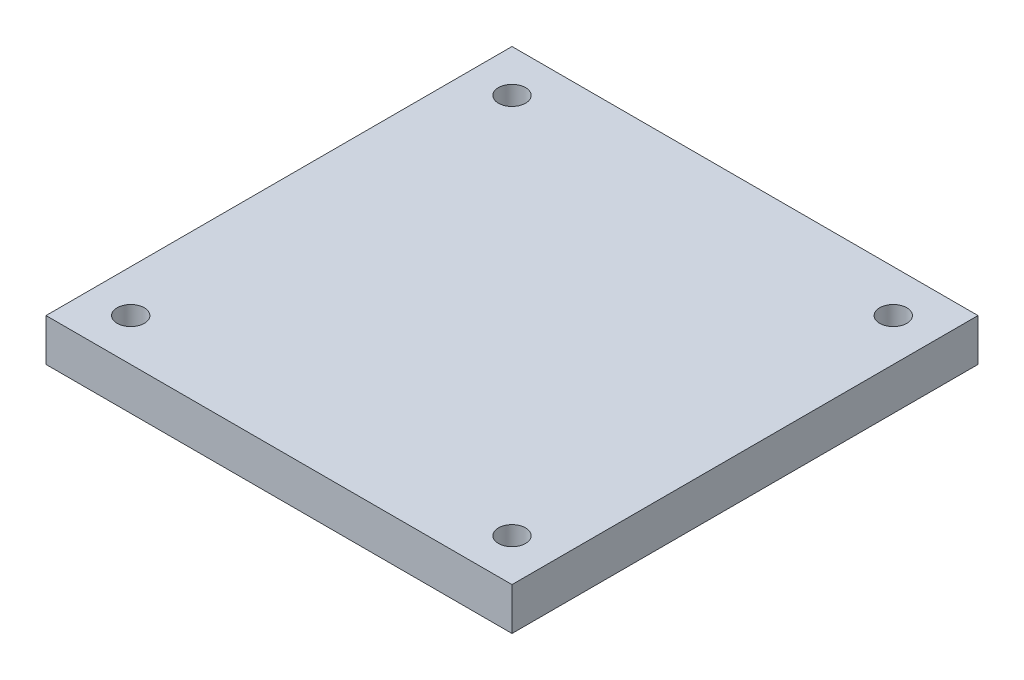
ISO-10303-21;
HEADER;
FILE_DESCRIPTION(('STEP AP214'),'2;1');
FILE_NAME('part.step','',(''),(''),'','','');
FILE_SCHEMA(('AUTOMOTIVE_DESIGN { 1 0 10303 214 1 1 1 1 }'));
ENDSEC;
DATA;
#1=APPLICATION_CONTEXT('core data for automotive mechanical design processes');
#2=APPLICATION_PROTOCOL_DEFINITION('international standard','automotive_design',2000,#1);
#3=PRODUCT_CONTEXT('',#1,'mechanical');
#4=PRODUCT('Part','Part','',(#3));
#5=PRODUCT_RELATED_PRODUCT_CATEGORY('part','',(#4));
#6=PRODUCT_DEFINITION_FORMATION('','',#4);
#7=PRODUCT_DEFINITION_CONTEXT('part definition',#1,'design');
#8=PRODUCT_DEFINITION('design','',#6,#7);
#9=PRODUCT_DEFINITION_SHAPE('','',#8);
#10=(LENGTH_UNIT() NAMED_UNIT(*) SI_UNIT(.MILLI.,.METRE.));
#11=(NAMED_UNIT(*) PLANE_ANGLE_UNIT() SI_UNIT($,.RADIAN.));
#12=(NAMED_UNIT(*) SI_UNIT($,.STERADIAN.) SOLID_ANGLE_UNIT());
#13=UNCERTAINTY_MEASURE_WITH_UNIT(LENGTH_MEASURE(1.E-05),#10,'distance_accuracy_value','');
#14=(GEOMETRIC_REPRESENTATION_CONTEXT(3) GLOBAL_UNCERTAINTY_ASSIGNED_CONTEXT((#13)) GLOBAL_UNIT_ASSIGNED_CONTEXT((#10,
#11,#12)) REPRESENTATION_CONTEXT('',''));
#15=CARTESIAN_POINT('',(0.,0.,0.));
#16=DIRECTION('',(0.,0.,1.));
#17=DIRECTION('',(1.,0.,0.));
#18=AXIS2_PLACEMENT_3D('',#15,#16,#17);
#19=CARTESIAN_POINT('',(-27.5,5.,27.5));
#20=DIRECTION('',(1.,0.,0.));
#21=DIRECTION('',(0.,0.,-1.));
#22=AXIS2_PLACEMENT_3D('',#19,#20,#21);
#23=PLANE('',#22);
#24=DIRECTION('',(0.,0.,1.));
#25=VECTOR('',#24,1.);
#26=CARTESIAN_POINT('',(-27.5,0.,27.5));
#27=LINE('',#26,#25);
#28=CARTESIAN_POINT('',(-27.5,0.,-27.5));
#29=VERTEX_POINT('',#28);
#30=CARTESIAN_POINT('',(-27.5,0.,27.5));
#31=VERTEX_POINT('',#30);
#32=EDGE_CURVE('E99',#29,#31,#27,.T.);
#33=ORIENTED_EDGE('',*,*,#32,.T.);
#34=DIRECTION('',(0.,-1.,0.));
#35=VECTOR('',#34,1.);
#36=CARTESIAN_POINT('',(-27.5,5.,27.5));
#37=LINE('',#36,#35);
#38=CARTESIAN_POINT('',(-27.5,5.,27.5));
#39=VERTEX_POINT('',#38);
#40=EDGE_CURVE('E11',#39,#31,#37,.T.);
#41=ORIENTED_EDGE('',*,*,#40,.F.);
#42=DIRECTION('',(0.,0.,1.));
#43=VECTOR('',#42,1.);
#44=CARTESIAN_POINT('',(-27.5,5.,27.5));
#45=LINE('',#44,#43);
#46=CARTESIAN_POINT('',(-27.5,5.,-27.5));
#47=VERTEX_POINT('',#46);
#48=EDGE_CURVE('E87',#47,#39,#45,.T.);
#49=ORIENTED_EDGE('',*,*,#48,.F.);
#50=DIRECTION('',(0.,-1.,0.));
#51=VECTOR('',#50,1.);
#52=CARTESIAN_POINT('',(-27.5,5.,-27.5));
#53=LINE('',#52,#51);
#54=EDGE_CURVE('E95',#47,#29,#53,.T.);
#55=ORIENTED_EDGE('',*,*,#54,.T.);
#56=EDGE_LOOP('',(#33,#41,#49,#55));
#57=FACE_BOUND('',#56,.T.);
#58=ADVANCED_FACE('F36',(#57),#23,.F.);
#59=CARTESIAN_POINT('',(27.5,5.,27.5));
#60=DIRECTION('',(0.,0.,-1.));
#61=DIRECTION('',(-1.,0.,0.));
#62=AXIS2_PLACEMENT_3D('',#59,#60,#61);
#63=PLANE('',#62);
#64=DIRECTION('',(1.,0.,0.));
#65=VECTOR('',#64,1.);
#66=CARTESIAN_POINT('',(27.5,0.,27.5));
#67=LINE('',#66,#65);
#68=CARTESIAN_POINT('',(27.5,0.,27.5));
#69=VERTEX_POINT('',#68);
#70=EDGE_CURVE('E91',#31,#69,#67,.T.);
#71=ORIENTED_EDGE('',*,*,#70,.T.);
#72=DIRECTION('',(0.,-1.,0.));
#73=VECTOR('',#72,1.);
#74=CARTESIAN_POINT('',(27.5,5.,27.5));
#75=LINE('',#74,#73);
#76=CARTESIAN_POINT('',(27.5,5.,27.5));
#77=VERTEX_POINT('',#76);
#78=EDGE_CURVE('E44',#77,#69,#75,.T.);
#79=ORIENTED_EDGE('',*,*,#78,.F.);
#80=DIRECTION('',(1.,0.,0.));
#81=VECTOR('',#80,1.);
#82=CARTESIAN_POINT('',(27.5,5.,27.5));
#83=LINE('',#82,#81);
#84=EDGE_CURVE('E82',#39,#77,#83,.T.);
#85=ORIENTED_EDGE('',*,*,#84,.F.);
#86=ORIENTED_EDGE('',*,*,#40,.T.);
#87=EDGE_LOOP('',(#71,#79,#85,#86));
#88=FACE_BOUND('',#87,.T.);
#89=ADVANCED_FACE('F90',(#88),#63,.F.);
#90=CARTESIAN_POINT('',(27.5,5.,27.5));
#91=DIRECTION('',(-1.,0.,0.));
#92=DIRECTION('',(0.,0.,1.));
#93=AXIS2_PLACEMENT_3D('',#90,#91,#92);
#94=PLANE('',#93);
#95=DIRECTION('',(0.,0.,-1.));
#96=VECTOR('',#95,1.);
#97=CARTESIAN_POINT('',(27.5,0.,27.5));
#98=LINE('',#97,#96);
#99=CARTESIAN_POINT('',(27.5,0.,-27.5));
#100=VERTEX_POINT('',#99);
#101=EDGE_CURVE('E69',#69,#100,#98,.T.);
#102=ORIENTED_EDGE('',*,*,#101,.T.);
#103=DIRECTION('',(0.,-1.,0.));
#104=VECTOR('',#103,1.);
#105=CARTESIAN_POINT('',(27.5,5.,-27.5));
#106=LINE('',#105,#104);
#107=CARTESIAN_POINT('',(27.5,5.,-27.5));
#108=VERTEX_POINT('',#107);
#109=EDGE_CURVE('E92',#108,#100,#106,.T.);
#110=ORIENTED_EDGE('',*,*,#109,.F.);
#111=DIRECTION('',(0.,0.,-1.));
#112=VECTOR('',#111,1.);
#113=CARTESIAN_POINT('',(27.5,5.,27.5));
#114=LINE('',#113,#112);
#115=EDGE_CURVE('E85',#77,#108,#114,.T.);
#116=ORIENTED_EDGE('',*,*,#115,.F.);
#117=ORIENTED_EDGE('',*,*,#78,.T.);
#118=EDGE_LOOP('',(#102,#110,#116,#117));
#119=FACE_BOUND('',#118,.T.);
#120=ADVANCED_FACE('F93',(#119),#94,.F.);
#121=CARTESIAN_POINT('',(27.5,5.,-27.5));
#122=DIRECTION('',(0.,0.,1.));
#123=DIRECTION('',(1.,0.,0.));
#124=AXIS2_PLACEMENT_3D('',#121,#122,#123);
#125=PLANE('',#124);
#126=DIRECTION('',(-1.,0.,0.));
#127=VECTOR('',#126,1.);
#128=CARTESIAN_POINT('',(27.5,0.,-27.5));
#129=LINE('',#128,#127);
#130=EDGE_CURVE('E75',#100,#29,#129,.T.);
#131=ORIENTED_EDGE('',*,*,#130,.T.);
#132=ORIENTED_EDGE('',*,*,#54,.F.);
#133=DIRECTION('',(-1.,0.,0.));
#134=VECTOR('',#133,1.);
#135=CARTESIAN_POINT('',(27.5,5.,-27.5));
#136=LINE('',#135,#134);
#137=EDGE_CURVE('E52',#108,#47,#136,.T.);
#138=ORIENTED_EDGE('',*,*,#137,.F.);
#139=ORIENTED_EDGE('',*,*,#109,.T.);
#140=EDGE_LOOP('',(#131,#132,#138,#139));
#141=FACE_BOUND('',#140,.T.);
#142=ADVANCED_FACE('F107',(#141),#125,.F.);
#143=CARTESIAN_POINT('',(0.,5.,0.));
#144=DIRECTION('',(0.,1.,0.));
#145=DIRECTION('',(0.,0.,1.));
#146=AXIS2_PLACEMENT_3D('',#143,#144,#145);
#147=PLANE('',#146);
#148=CARTESIAN_POINT('',(-22.5,5.,-22.5));
#149=DIRECTION('',(0.,-1.,0.));
#150=DIRECTION('',(0.,0.,-1.));
#151=AXIS2_PLACEMENT_3D('',#148,#149,#150);
#152=CIRCLE('',#151,1.6);
#153=CARTESIAN_POINT('',(-22.5,5.,-24.1));
#154=VERTEX_POINT('',#153);
#155=EDGE_CURVE('E122',#154,#154,#152,.T.);
#156=ORIENTED_EDGE('',*,*,#155,.T.);
#157=EDGE_LOOP('',(#156));
#158=FACE_BOUND('',#157,.T.);
#159=CARTESIAN_POINT('',(22.5,5.,-22.5));
#160=DIRECTION('',(0.,-1.,0.));
#161=DIRECTION('',(0.,0.,-1.));
#162=AXIS2_PLACEMENT_3D('',#159,#160,#161);
#163=CIRCLE('',#162,1.6);
#164=CARTESIAN_POINT('',(22.5,5.,-24.1));
#165=VERTEX_POINT('',#164);
#166=EDGE_CURVE('E128',#165,#165,#163,.T.);
#167=ORIENTED_EDGE('',*,*,#166,.T.);
#168=EDGE_LOOP('',(#167));
#169=FACE_BOUND('',#168,.T.);
#170=CARTESIAN_POINT('',(22.5,5.,22.5));
#171=DIRECTION('',(0.,-1.,0.));
#172=DIRECTION('',(0.,0.,-1.));
#173=AXIS2_PLACEMENT_3D('',#170,#171,#172);
#174=CIRCLE('',#173,1.6);
#175=CARTESIAN_POINT('',(22.5,5.,20.9));
#176=VERTEX_POINT('',#175);
#177=EDGE_CURVE('E116',#176,#176,#174,.T.);
#178=ORIENTED_EDGE('',*,*,#177,.T.);
#179=EDGE_LOOP('',(#178));
#180=FACE_BOUND('',#179,.T.);
#181=CARTESIAN_POINT('',(-22.5,5.,22.5));
#182=DIRECTION('',(0.,-1.,0.));
#183=DIRECTION('',(0.,0.,-1.));
#184=AXIS2_PLACEMENT_3D('',#181,#182,#183);
#185=CIRCLE('',#184,1.6);
#186=CARTESIAN_POINT('',(-22.5,5.,20.9));
#187=VERTEX_POINT('',#186);
#188=EDGE_CURVE('E102',#187,#187,#185,.T.);
#189=ORIENTED_EDGE('',*,*,#188,.T.);
#190=EDGE_LOOP('',(#189));
#191=FACE_BOUND('',#190,.T.);
#192=ORIENTED_EDGE('',*,*,#48,.T.);
#193=ORIENTED_EDGE('',*,*,#84,.T.);
#194=ORIENTED_EDGE('',*,*,#115,.T.);
#195=ORIENTED_EDGE('',*,*,#137,.T.);
#196=EDGE_LOOP('',(#192,#193,#194,#195));
#197=FACE_BOUND('',#196,.T.);
#198=ADVANCED_FACE('F83',(#158,#169,#180,#191,#197),#147,.T.);
#199=CARTESIAN_POINT('',(0.,0.,0.));
#200=DIRECTION('',(0.,1.,0.));
#201=DIRECTION('',(0.,0.,1.));
#202=AXIS2_PLACEMENT_3D('',#199,#200,#201);
#203=PLANE('',#202);
#204=CARTESIAN_POINT('',(-22.5,0.,-22.5));
#205=DIRECTION('',(0.,-1.,0.));
#206=DIRECTION('',(0.,0.,-1.));
#207=AXIS2_PLACEMENT_3D('',#204,#205,#206);
#208=CIRCLE('',#207,1.6);
#209=CARTESIAN_POINT('',(-22.5,0.,-24.1));
#210=VERTEX_POINT('',#209);
#211=EDGE_CURVE('E119',#210,#210,#208,.T.);
#212=ORIENTED_EDGE('',*,*,#211,.F.);
#213=EDGE_LOOP('',(#212));
#214=FACE_BOUND('',#213,.T.);
#215=CARTESIAN_POINT('',(22.5,0.,-22.5));
#216=DIRECTION('',(0.,-1.,0.));
#217=DIRECTION('',(0.,0.,-1.));
#218=AXIS2_PLACEMENT_3D('',#215,#216,#217);
#219=CIRCLE('',#218,1.6);
#220=CARTESIAN_POINT('',(22.5,0.,-24.1));
#221=VERTEX_POINT('',#220);
#222=EDGE_CURVE('E125',#221,#221,#219,.T.);
#223=ORIENTED_EDGE('',*,*,#222,.F.);
#224=EDGE_LOOP('',(#223));
#225=FACE_BOUND('',#224,.T.);
#226=CARTESIAN_POINT('',(22.5,0.,22.5));
#227=DIRECTION('',(0.,-1.,0.));
#228=DIRECTION('',(0.,0.,-1.));
#229=AXIS2_PLACEMENT_3D('',#226,#227,#228);
#230=CIRCLE('',#229,1.6);
#231=CARTESIAN_POINT('',(22.5,0.,20.9));
#232=VERTEX_POINT('',#231);
#233=EDGE_CURVE('E131',#232,#232,#230,.T.);
#234=ORIENTED_EDGE('',*,*,#233,.F.);
#235=EDGE_LOOP('',(#234));
#236=FACE_BOUND('',#235,.T.);
#237=CARTESIAN_POINT('',(-22.5,0.,22.5));
#238=DIRECTION('',(0.,-1.,0.));
#239=DIRECTION('',(0.,0.,-1.));
#240=AXIS2_PLACEMENT_3D('',#237,#238,#239);
#241=CIRCLE('',#240,1.6);
#242=CARTESIAN_POINT('',(-22.5,0.,20.9));
#243=VERTEX_POINT('',#242);
#244=EDGE_CURVE('E113',#243,#243,#241,.T.);
#245=ORIENTED_EDGE('',*,*,#244,.F.);
#246=EDGE_LOOP('',(#245));
#247=FACE_BOUND('',#246,.T.);
#248=ORIENTED_EDGE('',*,*,#32,.F.);
#249=ORIENTED_EDGE('',*,*,#130,.F.);
#250=ORIENTED_EDGE('',*,*,#101,.F.);
#251=ORIENTED_EDGE('',*,*,#70,.F.);
#252=EDGE_LOOP('',(#248,#249,#250,#251));
#253=FACE_BOUND('',#252,.T.);
#254=ADVANCED_FACE('F110',(#214,#225,#236,#247,#253),#203,.F.);
#255=CARTESIAN_POINT('',(-22.5,5.,22.5));
#256=DIRECTION('',(0.,-1.,0.));
#257=DIRECTION('',(0.,0.,-1.));
#258=AXIS2_PLACEMENT_3D('',#255,#256,#257);
#259=CYLINDRICAL_SURFACE('',#258,1.6);
#260=ORIENTED_EDGE('',*,*,#188,.F.);
#261=EDGE_LOOP('',(#260));
#262=FACE_BOUND('',#261,.T.);
#263=ORIENTED_EDGE('',*,*,#244,.T.);
#264=EDGE_LOOP('',(#263));
#265=FACE_BOUND('',#264,.T.);
#266=ADVANCED_FACE('F143',(#262,#265),#259,.F.);
#267=CARTESIAN_POINT('',(22.5,5.,22.5));
#268=DIRECTION('',(0.,-1.,0.));
#269=DIRECTION('',(0.,0.,-1.));
#270=AXIS2_PLACEMENT_3D('',#267,#268,#269);
#271=CYLINDRICAL_SURFACE('',#270,1.6);
#272=ORIENTED_EDGE('',*,*,#177,.F.);
#273=EDGE_LOOP('',(#272));
#274=FACE_BOUND('',#273,.T.);
#275=ORIENTED_EDGE('',*,*,#233,.T.);
#276=EDGE_LOOP('',(#275));
#277=FACE_BOUND('',#276,.T.);
#278=ADVANCED_FACE('F139',(#274,#277),#271,.F.);
#279=CARTESIAN_POINT('',(22.5,5.,-22.5));
#280=DIRECTION('',(0.,-1.,0.));
#281=DIRECTION('',(0.,0.,-1.));
#282=AXIS2_PLACEMENT_3D('',#279,#280,#281);
#283=CYLINDRICAL_SURFACE('',#282,1.6);
#284=ORIENTED_EDGE('',*,*,#166,.F.);
#285=EDGE_LOOP('',(#284));
#286=FACE_BOUND('',#285,.T.);
#287=ORIENTED_EDGE('',*,*,#222,.T.);
#288=EDGE_LOOP('',(#287));
#289=FACE_BOUND('',#288,.T.);
#290=ADVANCED_FACE('F142',(#286,#289),#283,.F.);
#291=CARTESIAN_POINT('',(-22.5,5.,-22.5));
#292=DIRECTION('',(0.,-1.,0.));
#293=DIRECTION('',(0.,0.,-1.));
#294=AXIS2_PLACEMENT_3D('',#291,#292,#293);
#295=CYLINDRICAL_SURFACE('',#294,1.6);
#296=ORIENTED_EDGE('',*,*,#155,.F.);
#297=EDGE_LOOP('',(#296));
#298=FACE_BOUND('',#297,.T.);
#299=ORIENTED_EDGE('',*,*,#211,.T.);
#300=EDGE_LOOP('',(#299));
#301=FACE_BOUND('',#300,.T.);
#302=ADVANCED_FACE('F181',(#298,#301),#295,.F.);
#303=CLOSED_SHELL('',(#58,#89,#120,#142,#198,#254,#266,#278,#290,#302));
#304=MANIFOLD_SOLID_BREP('B2',#303);
#305=ADVANCED_BREP_SHAPE_REPRESENTATION('',(#18,#304),#14);
#306=SHAPE_DEFINITION_REPRESENTATION(#9,#305);
ENDSEC;
END-ISO-10303-21;
